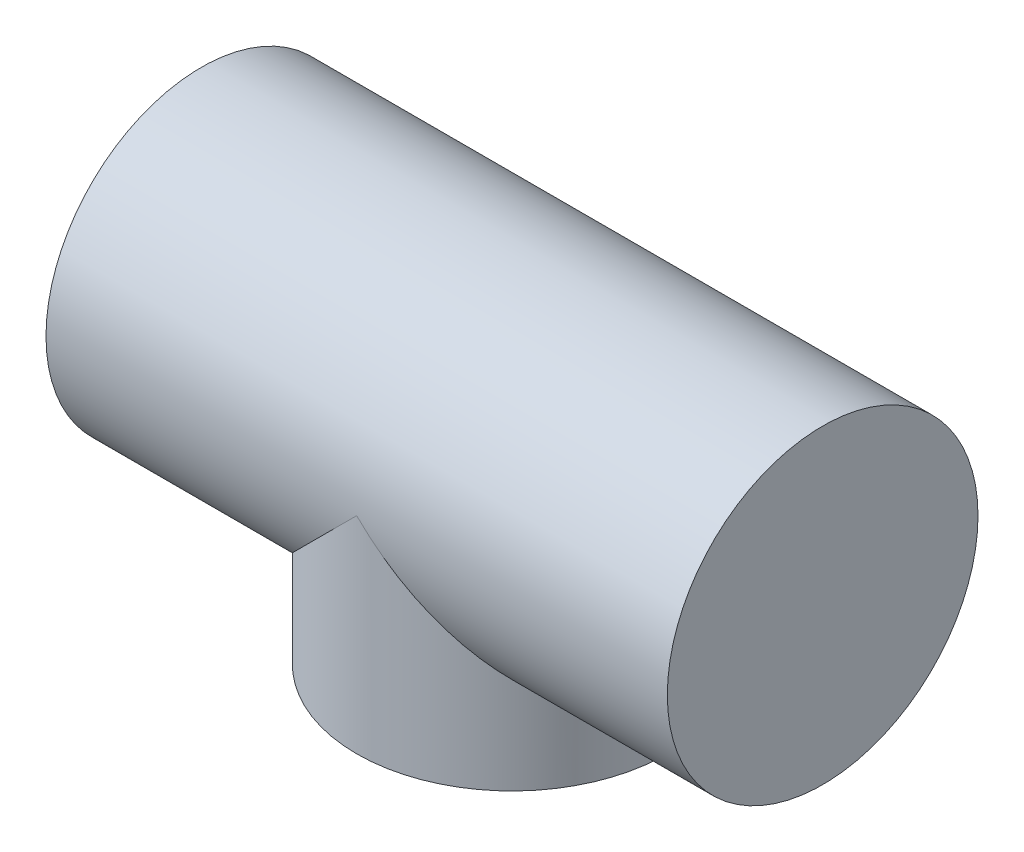
ISO-10303-21;
HEADER;
FILE_DESCRIPTION(('STEP AP214'),'2;1');
FILE_NAME('part.step','',(''),(''),'','','');
FILE_SCHEMA(('AUTOMOTIVE_DESIGN { 1 0 10303 214 1 1 1 1 }'));
ENDSEC;
DATA;
#1=APPLICATION_CONTEXT('core data for automotive mechanical design processes');
#2=APPLICATION_PROTOCOL_DEFINITION('international standard','automotive_design',2000,#1);
#3=PRODUCT_CONTEXT('',#1,'mechanical');
#4=PRODUCT('Part','Part','',(#3));
#5=PRODUCT_RELATED_PRODUCT_CATEGORY('part','',(#4));
#6=PRODUCT_DEFINITION_FORMATION('','',#4);
#7=PRODUCT_DEFINITION_CONTEXT('part definition',#1,'design');
#8=PRODUCT_DEFINITION('design','',#6,#7);
#9=PRODUCT_DEFINITION_SHAPE('','',#8);
#10=(LENGTH_UNIT() NAMED_UNIT(*) SI_UNIT(.MILLI.,.METRE.));
#11=(NAMED_UNIT(*) PLANE_ANGLE_UNIT() SI_UNIT($,.RADIAN.));
#12=(NAMED_UNIT(*) SI_UNIT($,.STERADIAN.) SOLID_ANGLE_UNIT());
#13=UNCERTAINTY_MEASURE_WITH_UNIT(LENGTH_MEASURE(1.E-05),#10,'distance_accuracy_value','');
#14=(GEOMETRIC_REPRESENTATION_CONTEXT(3) GLOBAL_UNCERTAINTY_ASSIGNED_CONTEXT((#13)) GLOBAL_UNIT_ASSIGNED_CONTEXT((#10,
#11,#12)) REPRESENTATION_CONTEXT('',''));
#15=CARTESIAN_POINT('',(0.,0.,0.));
#16=DIRECTION('',(0.,0.,1.));
#17=DIRECTION('',(1.,0.,0.));
#18=AXIS2_PLACEMENT_3D('',#15,#16,#17);
#19=CARTESIAN_POINT('',(0.,0.,0.));
#20=DIRECTION('',(1.,0.,0.));
#21=DIRECTION('',(0.,0.,-1.));
#22=AXIS2_PLACEMENT_3D('',#19,#20,#21);
#23=PLANE('',#22);
#24=CARTESIAN_POINT('',(0.,0.,0.));
#25=DIRECTION('',(1.,0.,0.));
#26=DIRECTION('',(0.,0.,-1.));
#27=AXIS2_PLACEMENT_3D('',#24,#25,#26);
#28=CIRCLE('',#27,25.);
#29=CARTESIAN_POINT('',(0.,0.,-25.));
#30=VERTEX_POINT('',#29);
#31=EDGE_CURVE('E55',#30,#30,#28,.T.);
#32=ORIENTED_EDGE('',*,*,#31,.F.);
#33=EDGE_LOOP('',(#32));
#34=FACE_BOUND('',#33,.T.);
#35=ADVANCED_FACE('F36',(#34),#23,.F.);
#36=CARTESIAN_POINT('',(100.,0.,0.));
#37=DIRECTION('',(1.,0.,0.));
#38=DIRECTION('',(0.,0.,-1.));
#39=AXIS2_PLACEMENT_3D('',#36,#37,#38);
#40=PLANE('',#39);
#41=CARTESIAN_POINT('',(100.,0.,0.));
#42=DIRECTION('',(1.,0.,0.));
#43=DIRECTION('',(0.,0.,-1.));
#44=AXIS2_PLACEMENT_3D('',#41,#42,#43);
#45=CIRCLE('',#44,25.);
#46=CARTESIAN_POINT('',(100.,0.,-25.));
#47=VERTEX_POINT('',#46);
#48=EDGE_CURVE('E53',#47,#47,#45,.T.);
#49=ORIENTED_EDGE('',*,*,#48,.T.);
#50=EDGE_LOOP('',(#49));
#51=FACE_BOUND('',#50,.T.);
#52=ADVANCED_FACE('F73',(#51),#40,.T.);
#53=CARTESIAN_POINT('',(0.,0.,0.));
#54=DIRECTION('',(1.,0.,0.));
#55=DIRECTION('',(0.,0.,-1.));
#56=AXIS2_PLACEMENT_3D('',#53,#54,#55);
#57=CYLINDRICAL_SURFACE('',#56,25.);
#58=CARTESIAN_POINT('',(50.,0.,0.));
#59=DIRECTION('',(0.707106781186548,0.707106781186547,0.));
#60=DIRECTION('',(0.707106781186548,-0.707106781186547,0.));
#61=AXIS2_PLACEMENT_3D('',#58,#59,#60);
#62=ELLIPSE('',#61,35.3553390593274,25.);
#63=CARTESIAN_POINT('',(50.,0.,-25.));
#64=VERTEX_POINT('',#63);
#65=CARTESIAN_POINT('',(50.,0.,25.));
#66=VERTEX_POINT('',#65);
#67=EDGE_CURVE('E11',#64,#66,#62,.F.);
#68=ORIENTED_EDGE('',*,*,#67,.F.);
#69=CARTESIAN_POINT('',(50.,0.,0.));
#70=DIRECTION('',(0.707106781186548,-0.707106781186547,0.));
#71=DIRECTION('',(0.707106781186548,0.707106781186547,0.));
#72=AXIS2_PLACEMENT_3D('',#69,#70,#71);
#73=ELLIPSE('',#72,35.3553390593274,25.);
#74=EDGE_CURVE('E43',#66,#64,#73,.T.);
#75=ORIENTED_EDGE('',*,*,#74,.F.);
#76=EDGE_LOOP('',(#68,#75));
#77=FACE_BOUND('',#76,.T.);
#78=ORIENTED_EDGE('',*,*,#48,.F.);
#79=EDGE_LOOP('',(#78));
#80=FACE_BOUND('',#79,.T.);
#81=ORIENTED_EDGE('',*,*,#31,.T.);
#82=EDGE_LOOP('',(#81));
#83=FACE_BOUND('',#82,.T.);
#84=ADVANCED_FACE('F49',(#77,#80,#83),#57,.T.);
#85=CARTESIAN_POINT('',(50.,-33.2,0.));
#86=DIRECTION('',(0.,1.,0.));
#87=DIRECTION('',(0.,0.,1.));
#88=AXIS2_PLACEMENT_3D('',#85,#86,#87);
#89=CYLINDRICAL_SURFACE('',#88,25.);
#90=CARTESIAN_POINT('',(50.,-33.2,0.));
#91=DIRECTION('',(0.,1.,0.));
#92=DIRECTION('',(0.,0.,1.));
#93=AXIS2_PLACEMENT_3D('',#90,#91,#92);
#94=CIRCLE('',#93,25.);
#95=CARTESIAN_POINT('',(50.,-33.2,25.));
#96=VERTEX_POINT('',#95);
#97=EDGE_CURVE('E60',#96,#96,#94,.T.);
#98=ORIENTED_EDGE('',*,*,#97,.T.);
#99=EDGE_LOOP('',(#98));
#100=FACE_BOUND('',#99,.T.);
#101=ORIENTED_EDGE('',*,*,#74,.T.);
#102=ORIENTED_EDGE('',*,*,#67,.T.);
#103=EDGE_LOOP('',(#101,#102));
#104=FACE_BOUND('',#103,.T.);
#105=ADVANCED_FACE('F52',(#100,#104),#89,.T.);
#106=CARTESIAN_POINT('',(50.,-33.2,0.));
#107=DIRECTION('',(0.,1.,0.));
#108=DIRECTION('',(0.,0.,1.));
#109=AXIS2_PLACEMENT_3D('',#106,#107,#108);
#110=PLANE('',#109);
#111=ORIENTED_EDGE('',*,*,#97,.F.);
#112=EDGE_LOOP('',(#111));
#113=FACE_BOUND('',#112,.T.);
#114=ADVANCED_FACE('F65',(#113),#110,.F.);
#115=CLOSED_SHELL('',(#35,#52,#84,#105,#114));
#116=MANIFOLD_SOLID_BREP('B2',#115);
#117=ADVANCED_BREP_SHAPE_REPRESENTATION('',(#18,#116),#14);
#118=SHAPE_DEFINITION_REPRESENTATION(#9,#117);
ENDSEC;
END-ISO-10303-21;
